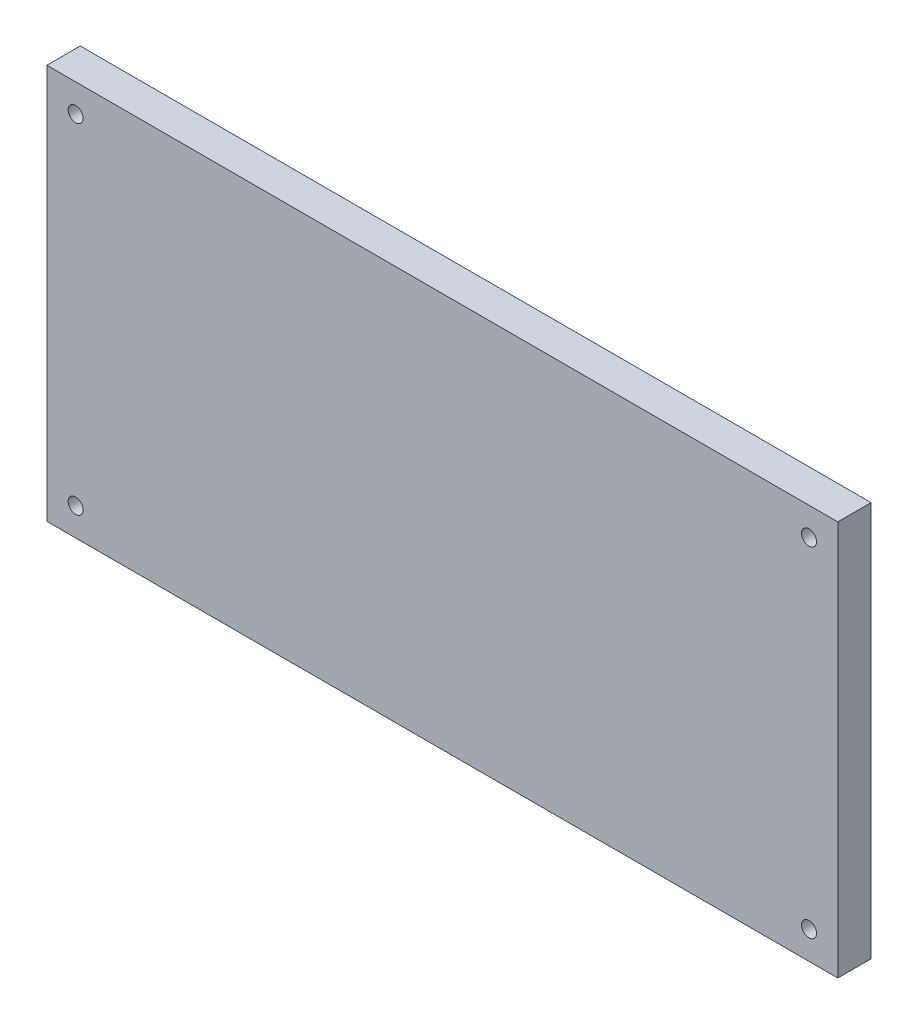
ISO-10303-21;
HEADER;
FILE_DESCRIPTION(('STEP AP214'),'2;1');
FILE_NAME('part.step','',(''),(''),'','','');
FILE_SCHEMA(('AUTOMOTIVE_DESIGN { 1 0 10303 214 1 1 1 1 }'));
ENDSEC;
DATA;
#1=APPLICATION_CONTEXT('core data for automotive mechanical design processes');
#2=APPLICATION_PROTOCOL_DEFINITION('international standard','automotive_design',2000,#1);
#3=PRODUCT_CONTEXT('',#1,'mechanical');
#4=PRODUCT('Part','Part','',(#3));
#5=PRODUCT_RELATED_PRODUCT_CATEGORY('part','',(#4));
#6=PRODUCT_DEFINITION_FORMATION('','',#4);
#7=PRODUCT_DEFINITION_CONTEXT('part definition',#1,'design');
#8=PRODUCT_DEFINITION('design','',#6,#7);
#9=PRODUCT_DEFINITION_SHAPE('','',#8);
#10=(LENGTH_UNIT() NAMED_UNIT(*) SI_UNIT(.MILLI.,.METRE.));
#11=(NAMED_UNIT(*) PLANE_ANGLE_UNIT() SI_UNIT($,.RADIAN.));
#12=(NAMED_UNIT(*) SI_UNIT($,.STERADIAN.) SOLID_ANGLE_UNIT());
#13=UNCERTAINTY_MEASURE_WITH_UNIT(LENGTH_MEASURE(1.E-05),#10,'distance_accuracy_value','');
#14=(GEOMETRIC_REPRESENTATION_CONTEXT(3) GLOBAL_UNCERTAINTY_ASSIGNED_CONTEXT((#13)) GLOBAL_UNIT_ASSIGNED_CONTEXT((#10,
#11,#12)) REPRESENTATION_CONTEXT('',''));
#15=CARTESIAN_POINT('',(0.,0.,0.));
#16=DIRECTION('',(0.,0.,1.));
#17=DIRECTION('',(1.,0.,0.));
#18=AXIS2_PLACEMENT_3D('',#15,#16,#17);
#19=CARTESIAN_POINT('',(0.,0.,4.));
#20=DIRECTION('',(0.,0.,-1.));
#21=DIRECTION('',(-1.,0.,0.));
#22=AXIS2_PLACEMENT_3D('',#19,#20,#21);
#23=PLANE('',#22);
#24=CARTESIAN_POINT('',(91.45,3.34999999999999,4.));
#25=DIRECTION('',(0.,0.,1.));
#26=DIRECTION('',(1.,0.,0.));
#27=AXIS2_PLACEMENT_3D('',#24,#25,#26);
#28=CIRCLE('',#27,0.900000000000004);
#29=CARTESIAN_POINT('',(92.35,3.34999999999999,4.));
#30=VERTEX_POINT('',#29);
#31=EDGE_CURVE('E121',#30,#30,#28,.T.);
#32=ORIENTED_EDGE('',*,*,#31,.F.);
#33=EDGE_LOOP('',(#32));
#34=FACE_BOUND('',#33,.T.);
#35=CARTESIAN_POINT('',(3.44999999999999,44.05,4.));
#36=DIRECTION('',(0.,0.,1.));
#37=DIRECTION('',(1.,0.,0.));
#38=AXIS2_PLACEMENT_3D('',#35,#36,#37);
#39=CIRCLE('',#38,0.899999999999999);
#40=CARTESIAN_POINT('',(4.34999999999999,44.05,4.));
#41=VERTEX_POINT('',#40);
#42=EDGE_CURVE('E100',#41,#41,#39,.T.);
#43=ORIENTED_EDGE('',*,*,#42,.F.);
#44=EDGE_LOOP('',(#43));
#45=FACE_BOUND('',#44,.T.);
#46=DIRECTION('',(0.,-1.,0.));
#47=VECTOR('',#46,1.);
#48=CARTESIAN_POINT('',(0.,0.,4.));
#49=LINE('',#48,#47);
#50=CARTESIAN_POINT('',(0.,47.4,4.));
#51=VERTEX_POINT('',#50);
#52=CARTESIAN_POINT('',(0.,0.,4.));
#53=VERTEX_POINT('',#52);
#54=EDGE_CURVE('E85',#51,#53,#49,.T.);
#55=ORIENTED_EDGE('',*,*,#54,.T.);
#56=DIRECTION('',(1.,0.,0.));
#57=VECTOR('',#56,1.);
#58=CARTESIAN_POINT('',(0.,0.,4.));
#59=LINE('',#58,#57);
#60=CARTESIAN_POINT('',(94.9,0.,4.));
#61=VERTEX_POINT('',#60);
#62=EDGE_CURVE('E80',#53,#61,#59,.T.);
#63=ORIENTED_EDGE('',*,*,#62,.T.);
#64=DIRECTION('',(0.,1.,0.));
#65=VECTOR('',#64,1.);
#66=CARTESIAN_POINT('',(94.9,0.,4.));
#67=LINE('',#66,#65);
#68=CARTESIAN_POINT('',(94.9,47.4,4.));
#69=VERTEX_POINT('',#68);
#70=EDGE_CURVE('E83',#61,#69,#67,.T.);
#71=ORIENTED_EDGE('',*,*,#70,.T.);
#72=DIRECTION('',(-1.,0.,0.));
#73=VECTOR('',#72,1.);
#74=CARTESIAN_POINT('',(0.,47.4,4.));
#75=LINE('',#74,#73);
#76=EDGE_CURVE('E50',#69,#51,#75,.T.);
#77=ORIENTED_EDGE('',*,*,#76,.T.);
#78=EDGE_LOOP('',(#55,#63,#71,#77));
#79=FACE_BOUND('',#78,.T.);
#80=CARTESIAN_POINT('',(3.44999999999999,3.34999999999999,4.));
#81=DIRECTION('',(0.,0.,1.));
#82=DIRECTION('',(1.,0.,0.));
#83=AXIS2_PLACEMENT_3D('',#80,#81,#82);
#84=CIRCLE('',#83,0.9);
#85=CARTESIAN_POINT('',(4.34999999999999,3.34999999999999,4.));
#86=VERTEX_POINT('',#85);
#87=EDGE_CURVE('E115',#86,#86,#84,.T.);
#88=ORIENTED_EDGE('',*,*,#87,.F.);
#89=EDGE_LOOP('',(#88));
#90=FACE_BOUND('',#89,.T.);
#91=CARTESIAN_POINT('',(91.45,44.05,4.));
#92=DIRECTION('',(0.,0.,1.));
#93=DIRECTION('',(1.,0.,0.));
#94=AXIS2_PLACEMENT_3D('',#91,#92,#93);
#95=CIRCLE('',#94,0.900000000000003);
#96=CARTESIAN_POINT('',(92.35,44.05,4.));
#97=VERTEX_POINT('',#96);
#98=EDGE_CURVE('E127',#97,#97,#95,.T.);
#99=ORIENTED_EDGE('',*,*,#98,.F.);
#100=EDGE_LOOP('',(#99));
#101=FACE_BOUND('',#100,.T.);
#102=ADVANCED_FACE('F33',(#34,#45,#79,#90,#101),#23,.F.);
#103=CARTESIAN_POINT('',(0.,0.,0.));
#104=DIRECTION('',(0.,0.,-1.));
#105=DIRECTION('',(-1.,0.,0.));
#106=AXIS2_PLACEMENT_3D('',#103,#104,#105);
#107=PLANE('',#106);
#108=CARTESIAN_POINT('',(91.45,3.34999999999999,0.));
#109=DIRECTION('',(0.,0.,1.));
#110=DIRECTION('',(1.,0.,0.));
#111=AXIS2_PLACEMENT_3D('',#108,#109,#110);
#112=CIRCLE('',#111,0.900000000000004);
#113=CARTESIAN_POINT('',(92.35,3.34999999999999,0.));
#114=VERTEX_POINT('',#113);
#115=EDGE_CURVE('E124',#114,#114,#112,.T.);
#116=ORIENTED_EDGE('',*,*,#115,.T.);
#117=EDGE_LOOP('',(#116));
#118=FACE_BOUND('',#117,.T.);
#119=CARTESIAN_POINT('',(3.44999999999999,44.05,0.));
#120=DIRECTION('',(0.,0.,1.));
#121=DIRECTION('',(1.,0.,0.));
#122=AXIS2_PLACEMENT_3D('',#119,#120,#121);
#123=CIRCLE('',#122,0.899999999999999);
#124=CARTESIAN_POINT('',(4.34999999999999,44.05,0.));
#125=VERTEX_POINT('',#124);
#126=EDGE_CURVE('E112',#125,#125,#123,.T.);
#127=ORIENTED_EDGE('',*,*,#126,.T.);
#128=EDGE_LOOP('',(#127));
#129=FACE_BOUND('',#128,.T.);
#130=DIRECTION('',(0.,-1.,0.));
#131=VECTOR('',#130,1.);
#132=CARTESIAN_POINT('',(0.,0.,0.));
#133=LINE('',#132,#131);
#134=CARTESIAN_POINT('',(0.,47.4,0.));
#135=VERTEX_POINT('',#134);
#136=CARTESIAN_POINT('',(0.,0.,0.));
#137=VERTEX_POINT('',#136);
#138=EDGE_CURVE('E97',#135,#137,#133,.T.);
#139=ORIENTED_EDGE('',*,*,#138,.F.);
#140=DIRECTION('',(-1.,0.,0.));
#141=VECTOR('',#140,1.);
#142=CARTESIAN_POINT('',(0.,47.4,0.));
#143=LINE('',#142,#141);
#144=CARTESIAN_POINT('',(94.9,47.4,0.));
#145=VERTEX_POINT('',#144);
#146=EDGE_CURVE('E73',#145,#135,#143,.T.);
#147=ORIENTED_EDGE('',*,*,#146,.F.);
#148=DIRECTION('',(0.,1.,0.));
#149=VECTOR('',#148,1.);
#150=CARTESIAN_POINT('',(94.9,0.,0.));
#151=LINE('',#150,#149);
#152=CARTESIAN_POINT('',(94.9,0.,0.));
#153=VERTEX_POINT('',#152);
#154=EDGE_CURVE('E67',#153,#145,#151,.T.);
#155=ORIENTED_EDGE('',*,*,#154,.F.);
#156=DIRECTION('',(1.,0.,0.));
#157=VECTOR('',#156,1.);
#158=CARTESIAN_POINT('',(0.,0.,0.));
#159=LINE('',#158,#157);
#160=EDGE_CURVE('E89',#137,#153,#159,.T.);
#161=ORIENTED_EDGE('',*,*,#160,.F.);
#162=EDGE_LOOP('',(#139,#147,#155,#161));
#163=FACE_BOUND('',#162,.T.);
#164=CARTESIAN_POINT('',(3.44999999999999,3.34999999999999,0.));
#165=DIRECTION('',(0.,0.,1.));
#166=DIRECTION('',(1.,0.,0.));
#167=AXIS2_PLACEMENT_3D('',#164,#165,#166);
#168=CIRCLE('',#167,0.9);
#169=CARTESIAN_POINT('',(4.34999999999999,3.34999999999999,0.));
#170=VERTEX_POINT('',#169);
#171=EDGE_CURVE('E118',#170,#170,#168,.T.);
#172=ORIENTED_EDGE('',*,*,#171,.T.);
#173=EDGE_LOOP('',(#172));
#174=FACE_BOUND('',#173,.T.);
#175=CARTESIAN_POINT('',(91.45,44.05,0.));
#176=DIRECTION('',(0.,0.,1.));
#177=DIRECTION('',(1.,0.,0.));
#178=AXIS2_PLACEMENT_3D('',#175,#176,#177);
#179=CIRCLE('',#178,0.900000000000003);
#180=CARTESIAN_POINT('',(92.35,44.05,0.));
#181=VERTEX_POINT('',#180);
#182=EDGE_CURVE('E130',#181,#181,#179,.T.);
#183=ORIENTED_EDGE('',*,*,#182,.T.);
#184=EDGE_LOOP('',(#183));
#185=FACE_BOUND('',#184,.T.);
#186=ADVANCED_FACE('F108',(#118,#129,#163,#174,#185),#107,.T.);
#187=CARTESIAN_POINT('',(0.,0.,4.));
#188=DIRECTION('',(1.,0.,0.));
#189=DIRECTION('',(0.,0.,-1.));
#190=AXIS2_PLACEMENT_3D('',#187,#188,#189);
#191=PLANE('',#190);
#192=ORIENTED_EDGE('',*,*,#138,.T.);
#193=DIRECTION('',(0.,0.,-1.));
#194=VECTOR('',#193,1.);
#195=CARTESIAN_POINT('',(0.,0.,4.));
#196=LINE('',#195,#194);
#197=EDGE_CURVE('E11',#53,#137,#196,.T.);
#198=ORIENTED_EDGE('',*,*,#197,.F.);
#199=ORIENTED_EDGE('',*,*,#54,.F.);
#200=DIRECTION('',(0.,0.,-1.));
#201=VECTOR('',#200,1.);
#202=CARTESIAN_POINT('',(0.,47.4,4.));
#203=LINE('',#202,#201);
#204=EDGE_CURVE('E93',#51,#135,#203,.T.);
#205=ORIENTED_EDGE('',*,*,#204,.T.);
#206=EDGE_LOOP('',(#192,#198,#199,#205));
#207=FACE_BOUND('',#206,.T.);
#208=ADVANCED_FACE('F35',(#207),#191,.F.);
#209=CARTESIAN_POINT('',(0.,0.,4.));
#210=DIRECTION('',(0.,1.,0.));
#211=DIRECTION('',(0.,0.,1.));
#212=AXIS2_PLACEMENT_3D('',#209,#210,#211);
#213=PLANE('',#212);
#214=ORIENTED_EDGE('',*,*,#160,.T.);
#215=DIRECTION('',(0.,0.,-1.));
#216=VECTOR('',#215,1.);
#217=CARTESIAN_POINT('',(94.9,0.,4.));
#218=LINE('',#217,#216);
#219=EDGE_CURVE('E42',#61,#153,#218,.T.);
#220=ORIENTED_EDGE('',*,*,#219,.F.);
#221=ORIENTED_EDGE('',*,*,#62,.F.);
#222=ORIENTED_EDGE('',*,*,#197,.T.);
#223=EDGE_LOOP('',(#214,#220,#221,#222));
#224=FACE_BOUND('',#223,.T.);
#225=ADVANCED_FACE('F88',(#224),#213,.F.);
#226=CARTESIAN_POINT('',(94.9,0.,4.));
#227=DIRECTION('',(-1.,0.,0.));
#228=DIRECTION('',(0.,0.,1.));
#229=AXIS2_PLACEMENT_3D('',#226,#227,#228);
#230=PLANE('',#229);
#231=ORIENTED_EDGE('',*,*,#154,.T.);
#232=DIRECTION('',(0.,0.,-1.));
#233=VECTOR('',#232,1.);
#234=CARTESIAN_POINT('',(94.9,47.4,4.));
#235=LINE('',#234,#233);
#236=EDGE_CURVE('E90',#69,#145,#235,.T.);
#237=ORIENTED_EDGE('',*,*,#236,.F.);
#238=ORIENTED_EDGE('',*,*,#70,.F.);
#239=ORIENTED_EDGE('',*,*,#219,.T.);
#240=EDGE_LOOP('',(#231,#237,#238,#239));
#241=FACE_BOUND('',#240,.T.);
#242=ADVANCED_FACE('F91',(#241),#230,.F.);
#243=CARTESIAN_POINT('',(0.,47.4,4.));
#244=DIRECTION('',(0.,-1.,0.));
#245=DIRECTION('',(0.,0.,-1.));
#246=AXIS2_PLACEMENT_3D('',#243,#244,#245);
#247=PLANE('',#246);
#248=ORIENTED_EDGE('',*,*,#146,.T.);
#249=ORIENTED_EDGE('',*,*,#204,.F.);
#250=ORIENTED_EDGE('',*,*,#76,.F.);
#251=ORIENTED_EDGE('',*,*,#236,.T.);
#252=EDGE_LOOP('',(#248,#249,#250,#251));
#253=FACE_BOUND('',#252,.T.);
#254=ADVANCED_FACE('F105',(#253),#247,.F.);
#255=CARTESIAN_POINT('',(3.44999999999999,44.05,4.));
#256=DIRECTION('',(0.,0.,-1.));
#257=DIRECTION('',(-1.,0.,0.));
#258=AXIS2_PLACEMENT_3D('',#255,#256,#257);
#259=CYLINDRICAL_SURFACE('',#258,0.899999999999999);
#260=ORIENTED_EDGE('',*,*,#42,.T.);
#261=EDGE_LOOP('',(#260));
#262=FACE_BOUND('',#261,.T.);
#263=ORIENTED_EDGE('',*,*,#126,.F.);
#264=EDGE_LOOP('',(#263));
#265=FACE_BOUND('',#264,.T.);
#266=ADVANCED_FACE('F150',(#262,#265),#259,.F.);
#267=CARTESIAN_POINT('',(3.44999999999999,3.34999999999999,4.));
#268=DIRECTION('',(0.,0.,-1.));
#269=DIRECTION('',(-1.,0.,0.));
#270=AXIS2_PLACEMENT_3D('',#267,#268,#269);
#271=CYLINDRICAL_SURFACE('',#270,0.9);
#272=ORIENTED_EDGE('',*,*,#87,.T.);
#273=EDGE_LOOP('',(#272));
#274=FACE_BOUND('',#273,.T.);
#275=ORIENTED_EDGE('',*,*,#171,.F.);
#276=EDGE_LOOP('',(#275));
#277=FACE_BOUND('',#276,.T.);
#278=ADVANCED_FACE('F196',(#274,#277),#271,.F.);
#279=CARTESIAN_POINT('',(91.45,3.34999999999999,4.));
#280=DIRECTION('',(0.,0.,-1.));
#281=DIRECTION('',(-1.,0.,0.));
#282=AXIS2_PLACEMENT_3D('',#279,#280,#281);
#283=CYLINDRICAL_SURFACE('',#282,0.900000000000004);
#284=ORIENTED_EDGE('',*,*,#31,.T.);
#285=EDGE_LOOP('',(#284));
#286=FACE_BOUND('',#285,.T.);
#287=ORIENTED_EDGE('',*,*,#115,.F.);
#288=EDGE_LOOP('',(#287));
#289=FACE_BOUND('',#288,.T.);
#290=ADVANCED_FACE('F204',(#286,#289),#283,.F.);
#291=CARTESIAN_POINT('',(91.45,44.05,4.));
#292=DIRECTION('',(0.,0.,-1.));
#293=DIRECTION('',(-1.,0.,0.));
#294=AXIS2_PLACEMENT_3D('',#291,#292,#293);
#295=CYLINDRICAL_SURFACE('',#294,0.900000000000003);
#296=ORIENTED_EDGE('',*,*,#98,.T.);
#297=EDGE_LOOP('',(#296));
#298=FACE_BOUND('',#297,.T.);
#299=ORIENTED_EDGE('',*,*,#182,.F.);
#300=EDGE_LOOP('',(#299));
#301=FACE_BOUND('',#300,.T.);
#302=ADVANCED_FACE('F136',(#298,#301),#295,.F.);
#303=CLOSED_SHELL('',(#102,#186,#208,#225,#242,#254,#266,#278,#290,#302));
#304=MANIFOLD_SOLID_BREP('B2',#303);
#305=ADVANCED_BREP_SHAPE_REPRESENTATION('',(#18,#304),#14);
#306=SHAPE_DEFINITION_REPRESENTATION(#9,#305);
ENDSEC;
END-ISO-10303-21;
